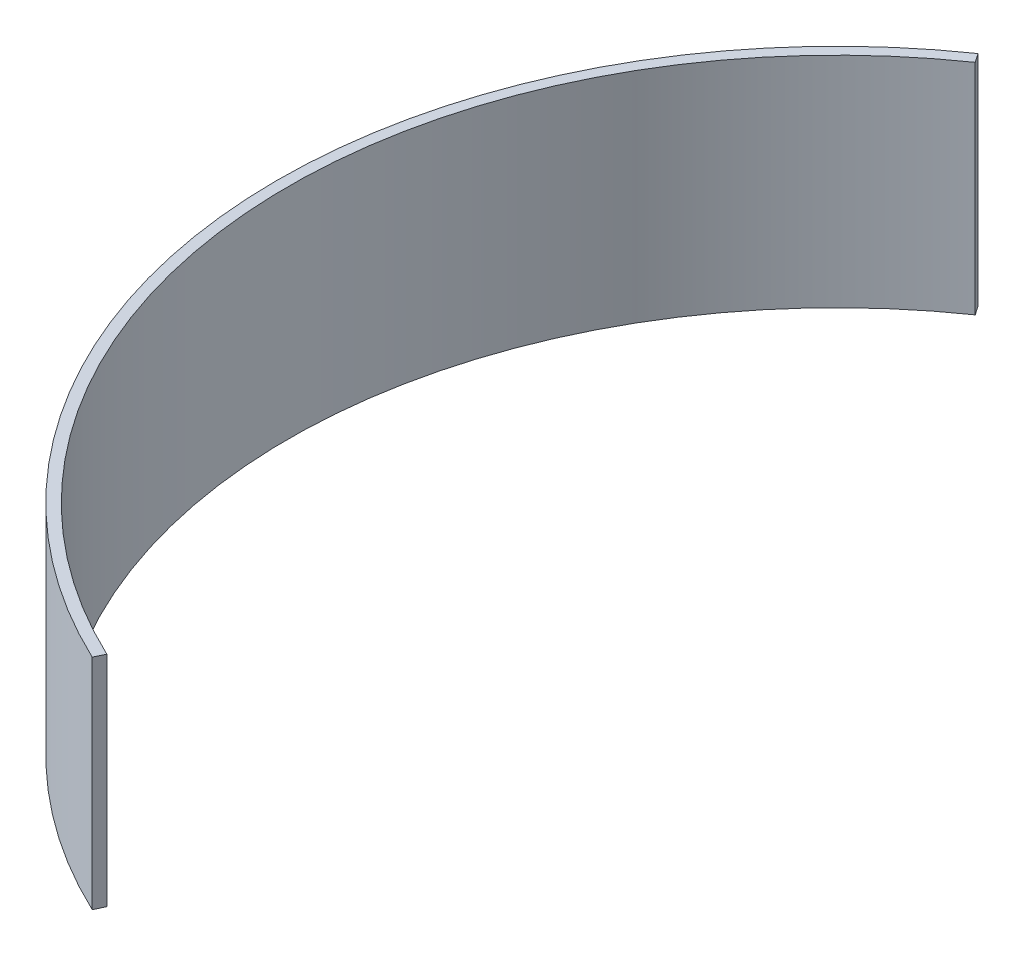
ISO-10303-21;
HEADER;
FILE_DESCRIPTION(('STEP AP214'),'2;1');
FILE_NAME('part.step','',(''),(''),'','','');
FILE_SCHEMA(('AUTOMOTIVE_DESIGN { 1 0 10303 214 1 1 1 1 }'));
ENDSEC;
DATA;
#1=APPLICATION_CONTEXT('core data for automotive mechanical design processes');
#2=APPLICATION_PROTOCOL_DEFINITION('international standard','automotive_design',2000,#1);
#3=PRODUCT_CONTEXT('',#1,'mechanical');
#4=PRODUCT('Part','Part','',(#3));
#5=PRODUCT_RELATED_PRODUCT_CATEGORY('part','',(#4));
#6=PRODUCT_DEFINITION_FORMATION('','',#4);
#7=PRODUCT_DEFINITION_CONTEXT('part definition',#1,'design');
#8=PRODUCT_DEFINITION('design','',#6,#7);
#9=PRODUCT_DEFINITION_SHAPE('','',#8);
#10=(LENGTH_UNIT() NAMED_UNIT(*) SI_UNIT(.MILLI.,.METRE.));
#11=(NAMED_UNIT(*) PLANE_ANGLE_UNIT() SI_UNIT($,.RADIAN.));
#12=(NAMED_UNIT(*) SI_UNIT($,.STERADIAN.) SOLID_ANGLE_UNIT());
#13=UNCERTAINTY_MEASURE_WITH_UNIT(LENGTH_MEASURE(1.E-05),#10,'distance_accuracy_value','');
#14=(GEOMETRIC_REPRESENTATION_CONTEXT(3) GLOBAL_UNCERTAINTY_ASSIGNED_CONTEXT((#13)) GLOBAL_UNIT_ASSIGNED_CONTEXT((#10,
#11,#12)) REPRESENTATION_CONTEXT('',''));
#15=CARTESIAN_POINT('',(0.,0.,0.));
#16=DIRECTION('',(0.,0.,1.));
#17=DIRECTION('',(1.,0.,0.));
#18=AXIS2_PLACEMENT_3D('',#15,#16,#17);
#19=CARTESIAN_POINT('',(0.,40.,0.));
#20=DIRECTION('',(0.,-1.,0.));
#21=DIRECTION('',(0.,0.,-1.));
#22=AXIS2_PLACEMENT_3D('',#19,#20,#21);
#23=CYLINDRICAL_SURFACE('',#22,100.305);
#24=CARTESIAN_POINT('',(0.,0.,0.));
#25=DIRECTION('',(0.,-1.,0.));
#26=DIRECTION('',(0.,0.,-1.));
#27=AXIS2_PLACEMENT_3D('',#24,#25,#26);
#28=CIRCLE('',#27,100.305);
#29=CARTESIAN_POINT('',(-42.8224760015323,0.,90.7046226721559));
#30=VERTEX_POINT('',#29);
#31=CARTESIAN_POINT('',(-57.141269474003,0.,-82.4376634063543));
#32=VERTEX_POINT('',#31);
#33=EDGE_CURVE('E97',#30,#32,#28,.T.);
#34=ORIENTED_EDGE('',*,*,#33,.T.);
#35=DIRECTION('',(0.,-1.,0.));
#36=VECTOR('',#35,1.);
#37=CARTESIAN_POINT('',(-57.141269474003,40.,-82.4376634063543));
#38=LINE('',#37,#36);
#39=CARTESIAN_POINT('',(-57.141269474003,40.,-82.4376634063543));
#40=VERTEX_POINT('',#39);
#41=EDGE_CURVE('E11',#40,#32,#38,.T.);
#42=ORIENTED_EDGE('',*,*,#41,.F.);
#43=CARTESIAN_POINT('',(0.,40.,0.));
#44=DIRECTION('',(0.,-1.,0.));
#45=DIRECTION('',(0.,0.,-1.));
#46=AXIS2_PLACEMENT_3D('',#43,#44,#45);
#47=CIRCLE('',#46,100.305);
#48=CARTESIAN_POINT('',(-42.8224760015323,40.,90.7046226721559));
#49=VERTEX_POINT('',#48);
#50=EDGE_CURVE('E85',#49,#40,#47,.T.);
#51=ORIENTED_EDGE('',*,*,#50,.F.);
#52=DIRECTION('',(0.,-1.,0.));
#53=VECTOR('',#52,1.);
#54=CARTESIAN_POINT('',(-42.8224760015323,40.,90.7046226721559));
#55=LINE('',#54,#53);
#56=EDGE_CURVE('E93',#49,#30,#55,.T.);
#57=ORIENTED_EDGE('',*,*,#56,.T.);
#58=EDGE_LOOP('',(#34,#42,#51,#57));
#59=FACE_BOUND('',#58,.T.);
#60=ADVANCED_FACE('F34',(#59),#23,.F.);
#61=CARTESIAN_POINT('',(-58.280619844852,40.,-84.0814032679037));
#62=DIRECTION('',(-0.821869930774682,0.,0.569675185424483));
#63=DIRECTION('',(0.569675185424483,0.,0.821869930774682));
#64=AXIS2_PLACEMENT_3D('',#61,#62,#63);
#65=PLANE('',#64);
#66=DIRECTION('',(-0.569675185424483,0.,-0.821869930774682));
#67=VECTOR('',#66,1.);
#68=CARTESIAN_POINT('',(-58.280619844852,0.,-84.0814032679037));
#69=LINE('',#68,#67);
#70=CARTESIAN_POINT('',(-58.280619844852,0.,-84.0814032679037));
#71=VERTEX_POINT('',#70);
#72=EDGE_CURVE('E89',#32,#71,#69,.T.);
#73=ORIENTED_EDGE('',*,*,#72,.T.);
#74=DIRECTION('',(0.,-1.,0.));
#75=VECTOR('',#74,1.);
#76=CARTESIAN_POINT('',(-58.280619844852,40.,-84.0814032679037));
#77=LINE('',#76,#75);
#78=CARTESIAN_POINT('',(-58.280619844852,40.,-84.0814032679037));
#79=VERTEX_POINT('',#78);
#80=EDGE_CURVE('E42',#79,#71,#77,.T.);
#81=ORIENTED_EDGE('',*,*,#80,.F.);
#82=DIRECTION('',(-0.569675185424483,0.,-0.821869930774682));
#83=VECTOR('',#82,1.);
#84=CARTESIAN_POINT('',(-58.280619844852,40.,-84.0814032679037));
#85=LINE('',#84,#83);
#86=EDGE_CURVE('E80',#40,#79,#85,.T.);
#87=ORIENTED_EDGE('',*,*,#86,.F.);
#88=ORIENTED_EDGE('',*,*,#41,.T.);
#89=EDGE_LOOP('',(#73,#81,#87,#88));
#90=FACE_BOUND('',#89,.T.);
#91=ADVANCED_FACE('F88',(#90),#65,.F.);
#92=CARTESIAN_POINT('',(0.,40.,0.));
#93=DIRECTION('',(0.,-1.,0.));
#94=DIRECTION('',(0.,0.,-1.));
#95=AXIS2_PLACEMENT_3D('',#92,#93,#94);
#96=CYLINDRICAL_SURFACE('',#95,102.305);
#97=CARTESIAN_POINT('',(0.,0.,0.));
#98=DIRECTION('',(0.,1.,0.));
#99=DIRECTION('',(0.,0.,1.));
#100=AXIS2_PLACEMENT_3D('',#97,#98,#99);
#101=CIRCLE('',#100,102.305);
#102=CARTESIAN_POINT('',(-43.6763212934227,0.,92.5131989678971));
#103=VERTEX_POINT('',#102);
#104=EDGE_CURVE('E67',#71,#103,#101,.T.);
#105=ORIENTED_EDGE('',*,*,#104,.T.);
#106=DIRECTION('',(0.,-1.,0.));
#107=VECTOR('',#106,1.);
#108=CARTESIAN_POINT('',(-43.6763212934227,40.,92.5131989678971));
#109=LINE('',#108,#107);
#110=CARTESIAN_POINT('',(-43.6763212934227,40.,92.5131989678971));
#111=VERTEX_POINT('',#110);
#112=EDGE_CURVE('E90',#111,#103,#109,.T.);
#113=ORIENTED_EDGE('',*,*,#112,.F.);
#114=CARTESIAN_POINT('',(0.,40.,0.));
#115=DIRECTION('',(0.,1.,0.));
#116=DIRECTION('',(0.,0.,1.));
#117=AXIS2_PLACEMENT_3D('',#114,#115,#116);
#118=CIRCLE('',#117,102.305);
#119=EDGE_CURVE('E83',#79,#111,#118,.T.);
#120=ORIENTED_EDGE('',*,*,#119,.F.);
#121=ORIENTED_EDGE('',*,*,#80,.T.);
#122=EDGE_LOOP('',(#105,#113,#120,#121));
#123=FACE_BOUND('',#122,.T.);
#124=ADVANCED_FACE('F91',(#123),#96,.T.);
#125=CARTESIAN_POINT('',(-42.8224760015323,40.,90.7046226721559));
#126=DIRECTION('',(-0.904288147870557,0.,-0.426922645945185));
#127=DIRECTION('',(-0.426922645945185,0.,0.904288147870557));
#128=AXIS2_PLACEMENT_3D('',#125,#126,#127);
#129=PLANE('',#128);
#130=DIRECTION('',(0.426922645945185,0.,-0.904288147870557));
#131=VECTOR('',#130,1.);
#132=CARTESIAN_POINT('',(-42.8224760015323,0.,90.7046226721559));
#133=LINE('',#132,#131);
#134=EDGE_CURVE('E73',#103,#30,#133,.T.);
#135=ORIENTED_EDGE('',*,*,#134,.T.);
#136=ORIENTED_EDGE('',*,*,#56,.F.);
#137=DIRECTION('',(0.426922645945185,0.,-0.904288147870557));
#138=VECTOR('',#137,1.);
#139=CARTESIAN_POINT('',(-42.8224760015323,40.,90.7046226721559));
#140=LINE('',#139,#138);
#141=EDGE_CURVE('E50',#111,#49,#140,.T.);
#142=ORIENTED_EDGE('',*,*,#141,.F.);
#143=ORIENTED_EDGE('',*,*,#112,.T.);
#144=EDGE_LOOP('',(#135,#136,#142,#143));
#145=FACE_BOUND('',#144,.T.);
#146=ADVANCED_FACE('F104',(#145),#129,.F.);
#147=CARTESIAN_POINT('',(0.,40.,0.));
#148=DIRECTION('',(0.,-1.,0.));
#149=DIRECTION('',(0.,0.,-1.));
#150=AXIS2_PLACEMENT_3D('',#147,#148,#149);
#151=PLANE('',#150);
#152=ORIENTED_EDGE('',*,*,#50,.T.);
#153=ORIENTED_EDGE('',*,*,#86,.T.);
#154=ORIENTED_EDGE('',*,*,#119,.T.);
#155=ORIENTED_EDGE('',*,*,#141,.T.);
#156=EDGE_LOOP('',(#152,#153,#154,#155));
#157=FACE_BOUND('',#156,.T.);
#158=ADVANCED_FACE('F81',(#157),#151,.F.);
#159=CARTESIAN_POINT('',(0.,0.,0.));
#160=DIRECTION('',(0.,-1.,0.));
#161=DIRECTION('',(0.,0.,-1.));
#162=AXIS2_PLACEMENT_3D('',#159,#160,#161);
#163=PLANE('',#162);
#164=ORIENTED_EDGE('',*,*,#33,.F.);
#165=ORIENTED_EDGE('',*,*,#134,.F.);
#166=ORIENTED_EDGE('',*,*,#104,.F.);
#167=ORIENTED_EDGE('',*,*,#72,.F.);
#168=EDGE_LOOP('',(#164,#165,#166,#167));
#169=FACE_BOUND('',#168,.T.);
#170=ADVANCED_FACE('F107',(#169),#163,.T.);
#171=CLOSED_SHELL('',(#60,#91,#124,#146,#158,#170));
#172=MANIFOLD_SOLID_BREP('B2',#171);
#173=ADVANCED_BREP_SHAPE_REPRESENTATION('',(#18,#172),#14);
#174=SHAPE_DEFINITION_REPRESENTATION(#9,#173);
ENDSEC;
END-ISO-10303-21;
